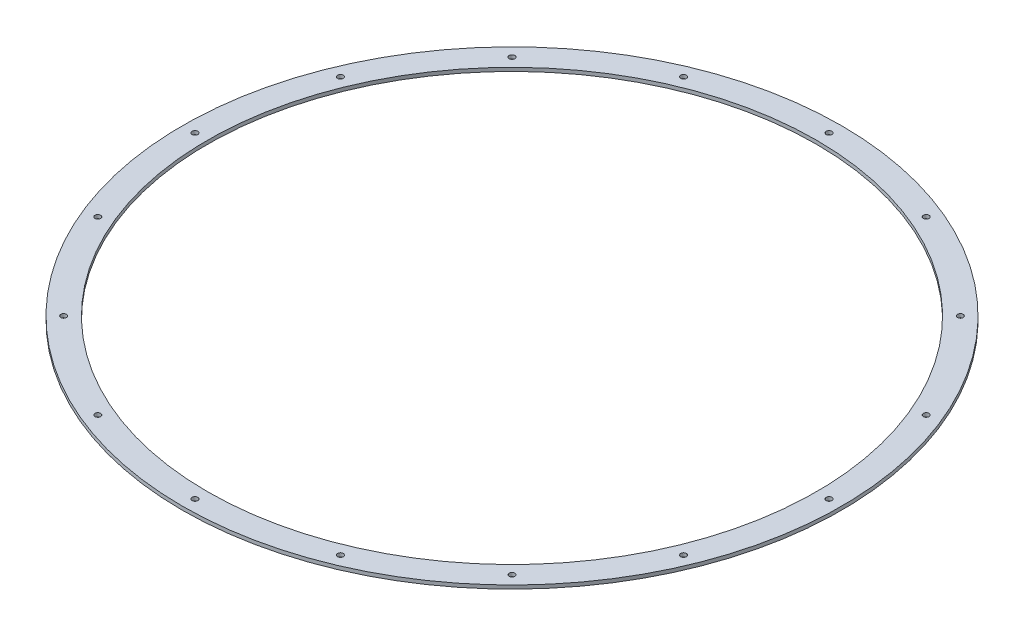
ISO-10303-21;
HEADER;
FILE_DESCRIPTION(('STEP AP214'),'2;1');
FILE_NAME('part.step','',(''),(''),'','','');
FILE_SCHEMA(('AUTOMOTIVE_DESIGN { 1 0 10303 214 1 1 1 1 }'));
ENDSEC;
DATA;
#1=APPLICATION_CONTEXT('core data for automotive mechanical design processes');
#2=APPLICATION_PROTOCOL_DEFINITION('international standard','automotive_design',2000,#1);
#3=PRODUCT_CONTEXT('',#1,'mechanical');
#4=PRODUCT('Part','Part','',(#3));
#5=PRODUCT_RELATED_PRODUCT_CATEGORY('part','',(#4));
#6=PRODUCT_DEFINITION_FORMATION('','',#4);
#7=PRODUCT_DEFINITION_CONTEXT('part definition',#1,'design');
#8=PRODUCT_DEFINITION('design','',#6,#7);
#9=PRODUCT_DEFINITION_SHAPE('','',#8);
#10=(LENGTH_UNIT() NAMED_UNIT(*) SI_UNIT(.MILLI.,.METRE.));
#11=(NAMED_UNIT(*) PLANE_ANGLE_UNIT() SI_UNIT($,.RADIAN.));
#12=(NAMED_UNIT(*) SI_UNIT($,.STERADIAN.) SOLID_ANGLE_UNIT());
#13=UNCERTAINTY_MEASURE_WITH_UNIT(LENGTH_MEASURE(1.E-05),#10,'distance_accuracy_value','');
#14=(GEOMETRIC_REPRESENTATION_CONTEXT(3) GLOBAL_UNCERTAINTY_ASSIGNED_CONTEXT((#13)) GLOBAL_UNIT_ASSIGNED_CONTEXT((#10,
#11,#12)) REPRESENTATION_CONTEXT('',''));
#15=CARTESIAN_POINT('',(0.,0.,0.));
#16=DIRECTION('',(0.,0.,1.));
#17=DIRECTION('',(1.,0.,0.));
#18=AXIS2_PLACEMENT_3D('',#15,#16,#17);
#19=CARTESIAN_POINT('',(0.,5.,0.));
#20=DIRECTION('',(0.,1.,0.));
#21=DIRECTION('',(0.,0.,1.));
#22=AXIS2_PLACEMENT_3D('',#19,#20,#21);
#23=PLANE('',#22);
#24=CARTESIAN_POINT('',(-312.894750675048,5.,-312.894750675047));
#25=DIRECTION('',(0.,1.,0.));
#26=DIRECTION('',(0.707106781186549,0.,0.707106781186546));
#27=AXIS2_PLACEMENT_3D('',#24,#25,#26);
#28=CIRCLE('',#27,4.);
#29=CARTESIAN_POINT('',(-310.066323550302,5.,-310.066323550301));
#30=VERTEX_POINT('',#29);
#31=EDGE_CURVE('E128',#30,#30,#28,.T.);
#32=ORIENTED_EDGE('',*,*,#31,.F.);
#33=EDGE_LOOP('',(#32));
#34=FACE_BOUND('',#33,.T.);
#35=CARTESIAN_POINT('',(-408.816693136245,5.,-169.337418821551));
#36=DIRECTION('',(0.,1.,0.));
#37=DIRECTION('',(0.923879532511288,0.,0.382683432365087));
#38=AXIS2_PLACEMENT_3D('',#35,#36,#37);
#39=CIRCLE('',#38,4.);
#40=CARTESIAN_POINT('',(-405.1211750062,5.,-167.806685092091));
#41=VERTEX_POINT('',#40);
#42=EDGE_CURVE('E120',#41,#41,#39,.T.);
#43=ORIENTED_EDGE('',*,*,#42,.F.);
#44=EDGE_LOOP('',(#43));
#45=FACE_BOUND('',#44,.T.);
#46=CARTESIAN_POINT('',(-442.5,5.,1.54498049243809E-12));
#47=DIRECTION('',(0.,1.,0.));
#48=DIRECTION('',(1.,0.,0.));
#49=AXIS2_PLACEMENT_3D('',#46,#47,#48);
#50=CIRCLE('',#49,4.);
#51=CARTESIAN_POINT('',(-438.5,5.,1.53101456708271E-12));
#52=VERTEX_POINT('',#51);
#53=EDGE_CURVE('E112',#52,#52,#50,.T.);
#54=ORIENTED_EDGE('',*,*,#53,.F.);
#55=EDGE_LOOP('',(#54));
#56=FACE_BOUND('',#55,.T.);
#57=CARTESIAN_POINT('',(-408.816693136244,5.,169.337418821554));
#58=DIRECTION('',(0.,1.,0.));
#59=DIRECTION('',(0.923879532511285,0.,-0.382683432365094));
#60=AXIS2_PLACEMENT_3D('',#57,#58,#59);
#61=CIRCLE('',#60,4.);
#62=CARTESIAN_POINT('',(-405.121175006199,5.,167.806685092094));
#63=VERTEX_POINT('',#62);
#64=EDGE_CURVE('E104',#63,#63,#61,.T.);
#65=ORIENTED_EDGE('',*,*,#64,.F.);
#66=EDGE_LOOP('',(#65));
#67=FACE_BOUND('',#66,.T.);
#68=CARTESIAN_POINT('',(-312.894750675046,5.,312.894750675049));
#69=DIRECTION('',(0.,1.,0.));
#70=DIRECTION('',(0.707106781186544,0.,-0.707106781186551));
#71=AXIS2_PLACEMENT_3D('',#68,#69,#70);
#72=CIRCLE('',#71,4.);
#73=CARTESIAN_POINT('',(-310.066323550299,5.,310.066323550303));
#74=VERTEX_POINT('',#73);
#75=EDGE_CURVE('E96',#74,#74,#72,.T.);
#76=ORIENTED_EDGE('',*,*,#75,.F.);
#77=EDGE_LOOP('',(#76));
#78=FACE_BOUND('',#77,.T.);
#79=CARTESIAN_POINT('',(-169.33741882155,5.,408.816693136245));
#80=DIRECTION('',(0.,1.,0.));
#81=DIRECTION('',(0.382683432365084,0.,-0.923879532511289));
#82=AXIS2_PLACEMENT_3D('',#79,#80,#81);
#83=CIRCLE('',#82,4.);
#84=CARTESIAN_POINT('',(-167.806685092089,5.,405.1211750062));
#85=VERTEX_POINT('',#84);
#86=EDGE_CURVE('E88',#85,#85,#83,.T.);
#87=ORIENTED_EDGE('',*,*,#86,.F.);
#88=EDGE_LOOP('',(#87));
#89=FACE_BOUND('',#88,.T.);
#90=CARTESIAN_POINT('',(0.,5.,442.5));
#91=DIRECTION('',(0.,1.,0.));
#92=DIRECTION('',(0.,0.,-1.));
#93=AXIS2_PLACEMENT_3D('',#90,#91,#92);
#94=CIRCLE('',#93,4.);
#95=CARTESIAN_POINT('',(0.,5.,438.5));
#96=VERTEX_POINT('',#95);
#97=EDGE_CURVE('E78',#96,#96,#94,.T.);
#98=ORIENTED_EDGE('',*,*,#97,.F.);
#99=EDGE_LOOP('',(#98));
#100=FACE_BOUND('',#99,.T.);
#101=CARTESIAN_POINT('',(169.337418821555,5.,408.816693136243));
#102=DIRECTION('',(0.,1.,0.));
#103=DIRECTION('',(-0.382683432365097,0.,-0.923879532511284));
#104=AXIS2_PLACEMENT_3D('',#101,#102,#103);
#105=CIRCLE('',#104,4.);
#106=CARTESIAN_POINT('',(167.806685092095,5.,405.121175006198));
#107=VERTEX_POINT('',#106);
#108=EDGE_CURVE('E79',#107,#107,#105,.T.);
#109=ORIENTED_EDGE('',*,*,#108,.F.);
#110=EDGE_LOOP('',(#109));
#111=FACE_BOUND('',#110,.T.);
#112=CARTESIAN_POINT('',(312.89475067505,5.,312.894750675045));
#113=DIRECTION('',(0.,1.,0.));
#114=DIRECTION('',(-0.707106781186554,0.,-0.707106781186541));
#115=AXIS2_PLACEMENT_3D('',#112,#113,#114);
#116=CIRCLE('',#115,4.);
#117=CARTESIAN_POINT('',(310.066323550304,5.,310.066323550298));
#118=VERTEX_POINT('',#117);
#119=EDGE_CURVE('E175',#118,#118,#116,.T.);
#120=ORIENTED_EDGE('',*,*,#119,.F.);
#121=EDGE_LOOP('',(#120));
#122=FACE_BOUND('',#121,.T.);
#123=CARTESIAN_POINT('',(408.816693136246,5.,169.337418821548));
#124=DIRECTION('',(0.,1.,0.));
#125=DIRECTION('',(-0.923879532511291,0.,-0.382683432365081));
#126=AXIS2_PLACEMENT_3D('',#123,#124,#125);
#127=CIRCLE('',#126,4.);
#128=CARTESIAN_POINT('',(405.121175006201,5.,167.806685092088));
#129=VERTEX_POINT('',#128);
#130=EDGE_CURVE('E167',#129,#129,#127,.T.);
#131=ORIENTED_EDGE('',*,*,#130,.F.);
#132=EDGE_LOOP('',(#131));
#133=FACE_BOUND('',#132,.T.);
#134=CARTESIAN_POINT('',(442.5,5.,-4.63494147731426E-12));
#135=DIRECTION('',(0.,1.,0.));
#136=DIRECTION('',(-1.,0.,0.));
#137=AXIS2_PLACEMENT_3D('',#134,#135,#136);
#138=CIRCLE('',#137,4.);
#139=CARTESIAN_POINT('',(438.5,5.,-4.59304370124814E-12));
#140=VERTEX_POINT('',#139);
#141=EDGE_CURVE('E159',#140,#140,#138,.T.);
#142=ORIENTED_EDGE('',*,*,#141,.F.);
#143=EDGE_LOOP('',(#142));
#144=FACE_BOUND('',#143,.T.);
#145=CARTESIAN_POINT('',(408.816693136243,5.,-169.337418821557));
#146=DIRECTION('',(0.,1.,0.));
#147=DIRECTION('',(-0.923879532511283,0.,0.3826834323651));
#148=AXIS2_PLACEMENT_3D('',#145,#146,#147);
#149=CIRCLE('',#148,4.);
#150=CARTESIAN_POINT('',(405.121175006197,5.,-167.806685092096));
#151=VERTEX_POINT('',#150);
#152=EDGE_CURVE('E151',#151,#151,#149,.T.);
#153=ORIENTED_EDGE('',*,*,#152,.F.);
#154=EDGE_LOOP('',(#153));
#155=FACE_BOUND('',#154,.T.);
#156=CARTESIAN_POINT('',(312.894750675043,5.,-312.894750675051));
#157=DIRECTION('',(0.,1.,0.));
#158=DIRECTION('',(-0.707106781186539,0.,0.707106781186556));
#159=AXIS2_PLACEMENT_3D('',#156,#157,#158);
#160=CIRCLE('',#159,4.);
#161=CARTESIAN_POINT('',(310.066323550297,5.,-310.066323550305));
#162=VERTEX_POINT('',#161);
#163=EDGE_CURVE('E142',#162,#162,#160,.T.);
#164=ORIENTED_EDGE('',*,*,#163,.F.);
#165=EDGE_LOOP('',(#164));
#166=FACE_BOUND('',#165,.T.);
#167=CARTESIAN_POINT('',(169.337418821547,5.,-408.816693136247));
#168=DIRECTION('',(0.,1.,0.));
#169=DIRECTION('',(-0.382683432365077,0.,0.923879532511292));
#170=AXIS2_PLACEMENT_3D('',#167,#168,#169);
#171=CIRCLE('',#170,4.);
#172=CARTESIAN_POINT('',(167.806685092086,5.,-405.121175006202));
#173=VERTEX_POINT('',#172);
#174=EDGE_CURVE('E143',#173,#173,#171,.T.);
#175=ORIENTED_EDGE('',*,*,#174,.F.);
#176=EDGE_LOOP('',(#175));
#177=FACE_BOUND('',#176,.T.);
#178=CARTESIAN_POINT('',(-169.337418821553,5.,-408.816693136244));
#179=DIRECTION('',(0.,1.,0.));
#180=DIRECTION('',(0.382683432365091,0.,0.923879532511287));
#181=AXIS2_PLACEMENT_3D('',#178,#179,#180);
#182=CIRCLE('',#181,4.);
#183=CARTESIAN_POINT('',(-167.806685092092,5.,-405.121175006199));
#184=VERTEX_POINT('',#183);
#185=EDGE_CURVE('E69',#184,#184,#182,.T.);
#186=ORIENTED_EDGE('',*,*,#185,.F.);
#187=EDGE_LOOP('',(#186));
#188=FACE_BOUND('',#187,.T.);
#189=CARTESIAN_POINT('',(0.,5.,-442.5));
#190=DIRECTION('',(0.,1.,0.));
#191=DIRECTION('',(0.,0.,1.));
#192=AXIS2_PLACEMENT_3D('',#189,#190,#191);
#193=CIRCLE('',#192,4.);
#194=CARTESIAN_POINT('',(0.,5.,-438.5));
#195=VERTEX_POINT('',#194);
#196=EDGE_CURVE('E61',#195,#195,#193,.T.);
#197=ORIENTED_EDGE('',*,*,#196,.F.);
#198=EDGE_LOOP('',(#197));
#199=FACE_BOUND('',#198,.T.);
#200=CARTESIAN_POINT('',(0.,5.,0.));
#201=DIRECTION('',(0.,1.,0.));
#202=DIRECTION('',(0.,0.,1.));
#203=AXIS2_PLACEMENT_3D('',#200,#201,#202);
#204=CIRCLE('',#203,460.);
#205=CARTESIAN_POINT('',(0.,5.,460.));
#206=VERTEX_POINT('',#205);
#207=EDGE_CURVE('E10',#206,#206,#204,.T.);
#208=ORIENTED_EDGE('',*,*,#207,.T.);
#209=EDGE_LOOP('',(#208));
#210=FACE_BOUND('',#209,.T.);
#211=CARTESIAN_POINT('',(0.,5.,0.));
#212=DIRECTION('',(0.,1.,0.));
#213=DIRECTION('',(0.,0.,1.));
#214=AXIS2_PLACEMENT_3D('',#211,#212,#213);
#215=CIRCLE('',#214,425.);
#216=CARTESIAN_POINT('',(0.,5.,425.));
#217=VERTEX_POINT('',#216);
#218=EDGE_CURVE('E52',#217,#217,#215,.T.);
#219=ORIENTED_EDGE('',*,*,#218,.F.);
#220=EDGE_LOOP('',(#219));
#221=FACE_BOUND('',#220,.T.);
#222=ADVANCED_FACE('F36',(#34,#45,#56,#67,#78,#89,#100,#111,#122,#133,#144,#155,#166,#177,#188,
#199,#210,#221),#23,.T.);
#223=CARTESIAN_POINT('',(0.,0.,0.));
#224=DIRECTION('',(0.,1.,0.));
#225=DIRECTION('',(0.,0.,1.));
#226=AXIS2_PLACEMENT_3D('',#223,#224,#225);
#227=PLANE('',#226);
#228=CARTESIAN_POINT('',(-312.894750675048,0.,-312.894750675047));
#229=DIRECTION('',(0.,1.,0.));
#230=DIRECTION('',(0.707106781186549,0.,0.707106781186546));
#231=AXIS2_PLACEMENT_3D('',#228,#229,#230);
#232=CIRCLE('',#231,4.);
#233=CARTESIAN_POINT('',(-310.066323550302,0.,-310.066323550301));
#234=VERTEX_POINT('',#233);
#235=EDGE_CURVE('E73',#234,#234,#232,.T.);
#236=ORIENTED_EDGE('',*,*,#235,.T.);
#237=EDGE_LOOP('',(#236));
#238=FACE_BOUND('',#237,.T.);
#239=CARTESIAN_POINT('',(-408.816693136245,0.,-169.337418821551));
#240=DIRECTION('',(0.,1.,0.));
#241=DIRECTION('',(0.923879532511288,0.,0.382683432365087));
#242=AXIS2_PLACEMENT_3D('',#239,#240,#241);
#243=CIRCLE('',#242,4.);
#244=CARTESIAN_POINT('',(-405.1211750062,0.,-167.806685092091));
#245=VERTEX_POINT('',#244);
#246=EDGE_CURVE('E124',#245,#245,#243,.T.);
#247=ORIENTED_EDGE('',*,*,#246,.T.);
#248=EDGE_LOOP('',(#247));
#249=FACE_BOUND('',#248,.T.);
#250=CARTESIAN_POINT('',(-442.5,0.,1.54498049243809E-12));
#251=DIRECTION('',(0.,1.,0.));
#252=DIRECTION('',(1.,0.,0.));
#253=AXIS2_PLACEMENT_3D('',#250,#251,#252);
#254=CIRCLE('',#253,4.);
#255=CARTESIAN_POINT('',(-438.5,0.,1.53101456708271E-12));
#256=VERTEX_POINT('',#255);
#257=EDGE_CURVE('E116',#256,#256,#254,.T.);
#258=ORIENTED_EDGE('',*,*,#257,.T.);
#259=EDGE_LOOP('',(#258));
#260=FACE_BOUND('',#259,.T.);
#261=CARTESIAN_POINT('',(-408.816693136244,0.,169.337418821554));
#262=DIRECTION('',(0.,1.,0.));
#263=DIRECTION('',(0.923879532511285,0.,-0.382683432365094));
#264=AXIS2_PLACEMENT_3D('',#261,#262,#263);
#265=CIRCLE('',#264,4.);
#266=CARTESIAN_POINT('',(-405.121175006199,0.,167.806685092094));
#267=VERTEX_POINT('',#266);
#268=EDGE_CURVE('E108',#267,#267,#265,.T.);
#269=ORIENTED_EDGE('',*,*,#268,.T.);
#270=EDGE_LOOP('',(#269));
#271=FACE_BOUND('',#270,.T.);
#272=CARTESIAN_POINT('',(-312.894750675046,0.,312.894750675049));
#273=DIRECTION('',(0.,1.,0.));
#274=DIRECTION('',(0.707106781186544,0.,-0.707106781186551));
#275=AXIS2_PLACEMENT_3D('',#272,#273,#274);
#276=CIRCLE('',#275,4.);
#277=CARTESIAN_POINT('',(-310.066323550299,0.,310.066323550303));
#278=VERTEX_POINT('',#277);
#279=EDGE_CURVE('E100',#278,#278,#276,.T.);
#280=ORIENTED_EDGE('',*,*,#279,.T.);
#281=EDGE_LOOP('',(#280));
#282=FACE_BOUND('',#281,.T.);
#283=CARTESIAN_POINT('',(-169.33741882155,0.,408.816693136245));
#284=DIRECTION('',(0.,1.,0.));
#285=DIRECTION('',(0.382683432365084,0.,-0.923879532511289));
#286=AXIS2_PLACEMENT_3D('',#283,#284,#285);
#287=CIRCLE('',#286,4.);
#288=CARTESIAN_POINT('',(-167.806685092089,0.,405.1211750062));
#289=VERTEX_POINT('',#288);
#290=EDGE_CURVE('E92',#289,#289,#287,.T.);
#291=ORIENTED_EDGE('',*,*,#290,.T.);
#292=EDGE_LOOP('',(#291));
#293=FACE_BOUND('',#292,.T.);
#294=CARTESIAN_POINT('',(0.,0.,442.5));
#295=DIRECTION('',(0.,1.,0.));
#296=DIRECTION('',(0.,0.,-1.));
#297=AXIS2_PLACEMENT_3D('',#294,#295,#296);
#298=CIRCLE('',#297,4.);
#299=CARTESIAN_POINT('',(0.,0.,438.5));
#300=VERTEX_POINT('',#299);
#301=EDGE_CURVE('E84',#300,#300,#298,.T.);
#302=ORIENTED_EDGE('',*,*,#301,.T.);
#303=EDGE_LOOP('',(#302));
#304=FACE_BOUND('',#303,.T.);
#305=CARTESIAN_POINT('',(169.337418821555,0.,408.816693136243));
#306=DIRECTION('',(0.,1.,0.));
#307=DIRECTION('',(-0.382683432365097,0.,-0.923879532511284));
#308=AXIS2_PLACEMENT_3D('',#305,#306,#307);
#309=CIRCLE('',#308,4.);
#310=CARTESIAN_POINT('',(167.806685092095,0.,405.121175006198));
#311=VERTEX_POINT('',#310);
#312=EDGE_CURVE('E74',#311,#311,#309,.T.);
#313=ORIENTED_EDGE('',*,*,#312,.T.);
#314=EDGE_LOOP('',(#313));
#315=FACE_BOUND('',#314,.T.);
#316=CARTESIAN_POINT('',(312.89475067505,0.,312.894750675045));
#317=DIRECTION('',(0.,1.,0.));
#318=DIRECTION('',(-0.707106781186554,0.,-0.707106781186541));
#319=AXIS2_PLACEMENT_3D('',#316,#317,#318);
#320=CIRCLE('',#319,4.);
#321=CARTESIAN_POINT('',(310.066323550304,0.,310.066323550298));
#322=VERTEX_POINT('',#321);
#323=EDGE_CURVE('E83',#322,#322,#320,.T.);
#324=ORIENTED_EDGE('',*,*,#323,.T.);
#325=EDGE_LOOP('',(#324));
#326=FACE_BOUND('',#325,.T.);
#327=CARTESIAN_POINT('',(408.816693136246,0.,169.337418821548));
#328=DIRECTION('',(0.,1.,0.));
#329=DIRECTION('',(-0.923879532511291,0.,-0.382683432365081));
#330=AXIS2_PLACEMENT_3D('',#327,#328,#329);
#331=CIRCLE('',#330,4.);
#332=CARTESIAN_POINT('',(405.121175006201,0.,167.806685092088));
#333=VERTEX_POINT('',#332);
#334=EDGE_CURVE('E171',#333,#333,#331,.T.);
#335=ORIENTED_EDGE('',*,*,#334,.T.);
#336=EDGE_LOOP('',(#335));
#337=FACE_BOUND('',#336,.T.);
#338=CARTESIAN_POINT('',(442.5,0.,-4.63494147731426E-12));
#339=DIRECTION('',(0.,1.,0.));
#340=DIRECTION('',(-1.,0.,0.));
#341=AXIS2_PLACEMENT_3D('',#338,#339,#340);
#342=CIRCLE('',#341,4.);
#343=CARTESIAN_POINT('',(438.5,0.,-4.59304370124814E-12));
#344=VERTEX_POINT('',#343);
#345=EDGE_CURVE('E163',#344,#344,#342,.T.);
#346=ORIENTED_EDGE('',*,*,#345,.T.);
#347=EDGE_LOOP('',(#346));
#348=FACE_BOUND('',#347,.T.);
#349=CARTESIAN_POINT('',(408.816693136243,0.,-169.337418821557));
#350=DIRECTION('',(0.,1.,0.));
#351=DIRECTION('',(-0.923879532511283,0.,0.3826834323651));
#352=AXIS2_PLACEMENT_3D('',#349,#350,#351);
#353=CIRCLE('',#352,4.);
#354=CARTESIAN_POINT('',(405.121175006197,0.,-167.806685092096));
#355=VERTEX_POINT('',#354);
#356=EDGE_CURVE('E155',#355,#355,#353,.T.);
#357=ORIENTED_EDGE('',*,*,#356,.T.);
#358=EDGE_LOOP('',(#357));
#359=FACE_BOUND('',#358,.T.);
#360=CARTESIAN_POINT('',(312.894750675043,0.,-312.894750675051));
#361=DIRECTION('',(0.,1.,0.));
#362=DIRECTION('',(-0.707106781186539,0.,0.707106781186556));
#363=AXIS2_PLACEMENT_3D('',#360,#361,#362);
#364=CIRCLE('',#363,4.);
#365=CARTESIAN_POINT('',(310.066323550297,0.,-310.066323550305));
#366=VERTEX_POINT('',#365);
#367=EDGE_CURVE('E147',#366,#366,#364,.T.);
#368=ORIENTED_EDGE('',*,*,#367,.T.);
#369=EDGE_LOOP('',(#368));
#370=FACE_BOUND('',#369,.T.);
#371=CARTESIAN_POINT('',(169.337418821547,0.,-408.816693136247));
#372=DIRECTION('',(0.,1.,0.));
#373=DIRECTION('',(-0.382683432365077,0.,0.923879532511292));
#374=AXIS2_PLACEMENT_3D('',#371,#372,#373);
#375=CIRCLE('',#374,4.);
#376=CARTESIAN_POINT('',(167.806685092086,0.,-405.121175006202));
#377=VERTEX_POINT('',#376);
#378=EDGE_CURVE('E138',#377,#377,#375,.T.);
#379=ORIENTED_EDGE('',*,*,#378,.T.);
#380=EDGE_LOOP('',(#379));
#381=FACE_BOUND('',#380,.T.);
#382=CARTESIAN_POINT('',(-169.337418821553,0.,-408.816693136244));
#383=DIRECTION('',(0.,1.,0.));
#384=DIRECTION('',(0.382683432365091,0.,0.923879532511287));
#385=AXIS2_PLACEMENT_3D('',#382,#383,#384);
#386=CIRCLE('',#385,4.);
#387=CARTESIAN_POINT('',(-167.806685092092,0.,-405.121175006199));
#388=VERTEX_POINT('',#387);
#389=EDGE_CURVE('E65',#388,#388,#386,.T.);
#390=ORIENTED_EDGE('',*,*,#389,.T.);
#391=EDGE_LOOP('',(#390));
#392=FACE_BOUND('',#391,.T.);
#393=CARTESIAN_POINT('',(0.,0.,-442.5));
#394=DIRECTION('',(0.,1.,0.));
#395=DIRECTION('',(0.,0.,1.));
#396=AXIS2_PLACEMENT_3D('',#393,#394,#395);
#397=CIRCLE('',#396,4.);
#398=CARTESIAN_POINT('',(0.,0.,-438.5));
#399=VERTEX_POINT('',#398);
#400=EDGE_CURVE('E40',#399,#399,#397,.T.);
#401=ORIENTED_EDGE('',*,*,#400,.T.);
#402=EDGE_LOOP('',(#401));
#403=FACE_BOUND('',#402,.T.);
#404=CARTESIAN_POINT('',(0.,0.,0.));
#405=DIRECTION('',(0.,1.,0.));
#406=DIRECTION('',(0.,0.,1.));
#407=AXIS2_PLACEMENT_3D('',#404,#405,#406);
#408=CIRCLE('',#407,460.);
#409=CARTESIAN_POINT('',(0.,0.,460.));
#410=VERTEX_POINT('',#409);
#411=EDGE_CURVE('E45',#410,#410,#408,.T.);
#412=ORIENTED_EDGE('',*,*,#411,.F.);
#413=EDGE_LOOP('',(#412));
#414=FACE_BOUND('',#413,.T.);
#415=CARTESIAN_POINT('',(0.,0.,0.));
#416=DIRECTION('',(0.,1.,0.));
#417=DIRECTION('',(0.,0.,1.));
#418=AXIS2_PLACEMENT_3D('',#415,#416,#417);
#419=CIRCLE('',#418,425.);
#420=CARTESIAN_POINT('',(0.,0.,425.));
#421=VERTEX_POINT('',#420);
#422=EDGE_CURVE('E54',#421,#421,#419,.T.);
#423=ORIENTED_EDGE('',*,*,#422,.T.);
#424=EDGE_LOOP('',(#423));
#425=FACE_BOUND('',#424,.T.);
#426=ADVANCED_FACE('F192',(#238,#249,#260,#271,#282,#293,#304,#315,#326,#337,#348,#359,#370,
#381,#392,#403,#414,#425),#227,.F.);
#427=CARTESIAN_POINT('',(0.,5.,0.));
#428=DIRECTION('',(0.,-1.,0.));
#429=DIRECTION('',(0.,0.,-1.));
#430=AXIS2_PLACEMENT_3D('',#427,#428,#429);
#431=CYLINDRICAL_SURFACE('',#430,460.);
#432=ORIENTED_EDGE('',*,*,#207,.F.);
#433=EDGE_LOOP('',(#432));
#434=FACE_BOUND('',#433,.T.);
#435=ORIENTED_EDGE('',*,*,#411,.T.);
#436=EDGE_LOOP('',(#435));
#437=FACE_BOUND('',#436,.T.);
#438=ADVANCED_FACE('F38',(#434,#437),#431,.T.);
#439=CARTESIAN_POINT('',(0.,5.,0.));
#440=DIRECTION('',(0.,-1.,0.));
#441=DIRECTION('',(0.,0.,-1.));
#442=AXIS2_PLACEMENT_3D('',#439,#440,#441);
#443=CYLINDRICAL_SURFACE('',#442,425.);
#444=ORIENTED_EDGE('',*,*,#218,.T.);
#445=EDGE_LOOP('',(#444));
#446=FACE_BOUND('',#445,.T.);
#447=ORIENTED_EDGE('',*,*,#422,.F.);
#448=EDGE_LOOP('',(#447));
#449=FACE_BOUND('',#448,.T.);
#450=ADVANCED_FACE('F211',(#446,#449),#443,.F.);
#451=CARTESIAN_POINT('',(0.,-5.,-442.5));
#452=DIRECTION('',(0.,1.,0.));
#453=DIRECTION('',(0.,0.,1.));
#454=AXIS2_PLACEMENT_3D('',#451,#452,#453);
#455=CYLINDRICAL_SURFACE('',#454,4.);
#456=ORIENTED_EDGE('',*,*,#196,.T.);
#457=EDGE_LOOP('',(#456));
#458=FACE_BOUND('',#457,.T.);
#459=ORIENTED_EDGE('',*,*,#400,.F.);
#460=EDGE_LOOP('',(#459));
#461=FACE_BOUND('',#460,.T.);
#462=ADVANCED_FACE('F214',(#458,#461),#455,.F.);
#463=CARTESIAN_POINT('',(-169.337418821553,-5.,-408.816693136244));
#464=DIRECTION('',(0.,1.,0.));
#465=DIRECTION('',(0.382683432365091,0.,0.923879532511287));
#466=AXIS2_PLACEMENT_3D('',#463,#464,#465);
#467=CYLINDRICAL_SURFACE('',#466,4.);
#468=ORIENTED_EDGE('',*,*,#185,.T.);
#469=EDGE_LOOP('',(#468));
#470=FACE_BOUND('',#469,.T.);
#471=ORIENTED_EDGE('',*,*,#389,.F.);
#472=EDGE_LOOP('',(#471));
#473=FACE_BOUND('',#472,.T.);
#474=ADVANCED_FACE('F228',(#470,#473),#467,.F.);
#475=CARTESIAN_POINT('',(169.337418821547,-5.,-408.816693136247));
#476=DIRECTION('',(0.,1.,0.));
#477=DIRECTION('',(-0.382683432365077,0.,0.923879532511292));
#478=AXIS2_PLACEMENT_3D('',#475,#476,#477);
#479=CYLINDRICAL_SURFACE('',#478,4.);
#480=ORIENTED_EDGE('',*,*,#174,.T.);
#481=EDGE_LOOP('',(#480));
#482=FACE_BOUND('',#481,.T.);
#483=ORIENTED_EDGE('',*,*,#378,.F.);
#484=EDGE_LOOP('',(#483));
#485=FACE_BOUND('',#484,.T.);
#486=ADVANCED_FACE('F232',(#482,#485),#479,.F.);
#487=CARTESIAN_POINT('',(312.894750675043,-5.,-312.894750675051));
#488=DIRECTION('',(0.,1.,0.));
#489=DIRECTION('',(-0.707106781186539,0.,0.707106781186556));
#490=AXIS2_PLACEMENT_3D('',#487,#488,#489);
#491=CYLINDRICAL_SURFACE('',#490,4.);
#492=ORIENTED_EDGE('',*,*,#163,.T.);
#493=EDGE_LOOP('',(#492));
#494=FACE_BOUND('',#493,.T.);
#495=ORIENTED_EDGE('',*,*,#367,.F.);
#496=EDGE_LOOP('',(#495));
#497=FACE_BOUND('',#496,.T.);
#498=ADVANCED_FACE('F268',(#494,#497),#491,.F.);
#499=CARTESIAN_POINT('',(408.816693136243,-5.,-169.337418821557));
#500=DIRECTION('',(0.,1.,0.));
#501=DIRECTION('',(-0.923879532511283,0.,0.3826834323651));
#502=AXIS2_PLACEMENT_3D('',#499,#500,#501);
#503=CYLINDRICAL_SURFACE('',#502,4.);
#504=ORIENTED_EDGE('',*,*,#152,.T.);
#505=EDGE_LOOP('',(#504));
#506=FACE_BOUND('',#505,.T.);
#507=ORIENTED_EDGE('',*,*,#356,.F.);
#508=EDGE_LOOP('',(#507));
#509=FACE_BOUND('',#508,.T.);
#510=ADVANCED_FACE('F272',(#506,#509),#503,.F.);
#511=CARTESIAN_POINT('',(442.5,-5.,-4.63494147731426E-12));
#512=DIRECTION('',(0.,1.,0.));
#513=DIRECTION('',(-1.,0.,0.));
#514=AXIS2_PLACEMENT_3D('',#511,#512,#513);
#515=CYLINDRICAL_SURFACE('',#514,4.);
#516=ORIENTED_EDGE('',*,*,#141,.T.);
#517=EDGE_LOOP('',(#516));
#518=FACE_BOUND('',#517,.T.);
#519=ORIENTED_EDGE('',*,*,#345,.F.);
#520=EDGE_LOOP('',(#519));
#521=FACE_BOUND('',#520,.T.);
#522=ADVANCED_FACE('F276',(#518,#521),#515,.F.);
#523=CARTESIAN_POINT('',(408.816693136246,-5.,169.337418821548));
#524=DIRECTION('',(0.,1.,0.));
#525=DIRECTION('',(-0.923879532511291,0.,-0.382683432365081));
#526=AXIS2_PLACEMENT_3D('',#523,#524,#525);
#527=CYLINDRICAL_SURFACE('',#526,4.);
#528=ORIENTED_EDGE('',*,*,#130,.T.);
#529=EDGE_LOOP('',(#528));
#530=FACE_BOUND('',#529,.T.);
#531=ORIENTED_EDGE('',*,*,#334,.F.);
#532=EDGE_LOOP('',(#531));
#533=FACE_BOUND('',#532,.T.);
#534=ADVANCED_FACE('F280',(#530,#533),#527,.F.);
#535=CARTESIAN_POINT('',(312.89475067505,-5.,312.894750675045));
#536=DIRECTION('',(0.,1.,0.));
#537=DIRECTION('',(-0.707106781186554,0.,-0.707106781186541));
#538=AXIS2_PLACEMENT_3D('',#535,#536,#537);
#539=CYLINDRICAL_SURFACE('',#538,4.);
#540=ORIENTED_EDGE('',*,*,#119,.T.);
#541=EDGE_LOOP('',(#540));
#542=FACE_BOUND('',#541,.T.);
#543=ORIENTED_EDGE('',*,*,#323,.F.);
#544=EDGE_LOOP('',(#543));
#545=FACE_BOUND('',#544,.T.);
#546=ADVANCED_FACE('F187',(#542,#545),#539,.F.);
#547=CARTESIAN_POINT('',(169.337418821555,-5.,408.816693136243));
#548=DIRECTION('',(0.,1.,0.));
#549=DIRECTION('',(-0.382683432365097,0.,-0.923879532511284));
#550=AXIS2_PLACEMENT_3D('',#547,#548,#549);
#551=CYLINDRICAL_SURFACE('',#550,4.);
#552=ORIENTED_EDGE('',*,*,#108,.T.);
#553=EDGE_LOOP('',(#552));
#554=FACE_BOUND('',#553,.T.);
#555=ORIENTED_EDGE('',*,*,#312,.F.);
#556=EDGE_LOOP('',(#555));
#557=FACE_BOUND('',#556,.T.);
#558=ADVANCED_FACE('F234',(#554,#557),#551,.F.);
#559=CARTESIAN_POINT('',(0.,-5.,442.5));
#560=DIRECTION('',(0.,1.,0.));
#561=DIRECTION('',(0.,0.,-1.));
#562=AXIS2_PLACEMENT_3D('',#559,#560,#561);
#563=CYLINDRICAL_SURFACE('',#562,4.);
#564=ORIENTED_EDGE('',*,*,#97,.T.);
#565=EDGE_LOOP('',(#564));
#566=FACE_BOUND('',#565,.T.);
#567=ORIENTED_EDGE('',*,*,#301,.F.);
#568=EDGE_LOOP('',(#567));
#569=FACE_BOUND('',#568,.T.);
#570=ADVANCED_FACE('F237',(#566,#569),#563,.F.);
#571=CARTESIAN_POINT('',(-169.33741882155,-5.,408.816693136245));
#572=DIRECTION('',(0.,1.,0.));
#573=DIRECTION('',(0.382683432365084,0.,-0.923879532511289));
#574=AXIS2_PLACEMENT_3D('',#571,#572,#573);
#575=CYLINDRICAL_SURFACE('',#574,4.);
#576=ORIENTED_EDGE('',*,*,#86,.T.);
#577=EDGE_LOOP('',(#576));
#578=FACE_BOUND('',#577,.T.);
#579=ORIENTED_EDGE('',*,*,#290,.F.);
#580=EDGE_LOOP('',(#579));
#581=FACE_BOUND('',#580,.T.);
#582=ADVANCED_FACE('F241',(#578,#581),#575,.F.);
#583=CARTESIAN_POINT('',(-312.894750675046,-5.,312.894750675049));
#584=DIRECTION('',(0.,1.,0.));
#585=DIRECTION('',(0.707106781186544,0.,-0.707106781186551));
#586=AXIS2_PLACEMENT_3D('',#583,#584,#585);
#587=CYLINDRICAL_SURFACE('',#586,4.);
#588=ORIENTED_EDGE('',*,*,#75,.T.);
#589=EDGE_LOOP('',(#588));
#590=FACE_BOUND('',#589,.T.);
#591=ORIENTED_EDGE('',*,*,#279,.F.);
#592=EDGE_LOOP('',(#591));
#593=FACE_BOUND('',#592,.T.);
#594=ADVANCED_FACE('F245',(#590,#593),#587,.F.);
#595=CARTESIAN_POINT('',(-408.816693136244,-5.,169.337418821554));
#596=DIRECTION('',(0.,1.,0.));
#597=DIRECTION('',(0.923879532511285,0.,-0.382683432365094));
#598=AXIS2_PLACEMENT_3D('',#595,#596,#597);
#599=CYLINDRICAL_SURFACE('',#598,4.);
#600=ORIENTED_EDGE('',*,*,#64,.T.);
#601=EDGE_LOOP('',(#600));
#602=FACE_BOUND('',#601,.T.);
#603=ORIENTED_EDGE('',*,*,#268,.F.);
#604=EDGE_LOOP('',(#603));
#605=FACE_BOUND('',#604,.T.);
#606=ADVANCED_FACE('F249',(#602,#605),#599,.F.);
#607=CARTESIAN_POINT('',(-442.5,-5.,1.54498049243809E-12));
#608=DIRECTION('',(0.,1.,0.));
#609=DIRECTION('',(1.,0.,0.));
#610=AXIS2_PLACEMENT_3D('',#607,#608,#609);
#611=CYLINDRICAL_SURFACE('',#610,4.);
#612=ORIENTED_EDGE('',*,*,#53,.T.);
#613=EDGE_LOOP('',(#612));
#614=FACE_BOUND('',#613,.T.);
#615=ORIENTED_EDGE('',*,*,#257,.F.);
#616=EDGE_LOOP('',(#615));
#617=FACE_BOUND('',#616,.T.);
#618=ADVANCED_FACE('F253',(#614,#617),#611,.F.);
#619=CARTESIAN_POINT('',(-408.816693136245,-5.,-169.337418821551));
#620=DIRECTION('',(0.,1.,0.));
#621=DIRECTION('',(0.923879532511288,0.,0.382683432365087));
#622=AXIS2_PLACEMENT_3D('',#619,#620,#621);
#623=CYLINDRICAL_SURFACE('',#622,4.);
#624=ORIENTED_EDGE('',*,*,#42,.T.);
#625=EDGE_LOOP('',(#624));
#626=FACE_BOUND('',#625,.T.);
#627=ORIENTED_EDGE('',*,*,#246,.F.);
#628=EDGE_LOOP('',(#627));
#629=FACE_BOUND('',#628,.T.);
#630=ADVANCED_FACE('F257',(#626,#629),#623,.F.);
#631=CARTESIAN_POINT('',(-312.894750675048,-5.,-312.894750675047));
#632=DIRECTION('',(0.,1.,0.));
#633=DIRECTION('',(0.707106781186549,0.,0.707106781186546));
#634=AXIS2_PLACEMENT_3D('',#631,#632,#633);
#635=CYLINDRICAL_SURFACE('',#634,4.);
#636=ORIENTED_EDGE('',*,*,#31,.T.);
#637=EDGE_LOOP('',(#636));
#638=FACE_BOUND('',#637,.T.);
#639=ORIENTED_EDGE('',*,*,#235,.F.);
#640=EDGE_LOOP('',(#639));
#641=FACE_BOUND('',#640,.T.);
#642=ADVANCED_FACE('F261',(#638,#641),#635,.F.);
#643=CLOSED_SHELL('',(#222,#426,#438,#450,#462,#474,#486,#498,#510,#522,#534,#546,#558,#570,
#582,#594,#606,#618,#630,#642));
#644=MANIFOLD_SOLID_BREP('B2',#643);
#645=ADVANCED_BREP_SHAPE_REPRESENTATION('',(#18,#644),#14);
#646=SHAPE_DEFINITION_REPRESENTATION(#9,#645);
ENDSEC;
END-ISO-10303-21;
